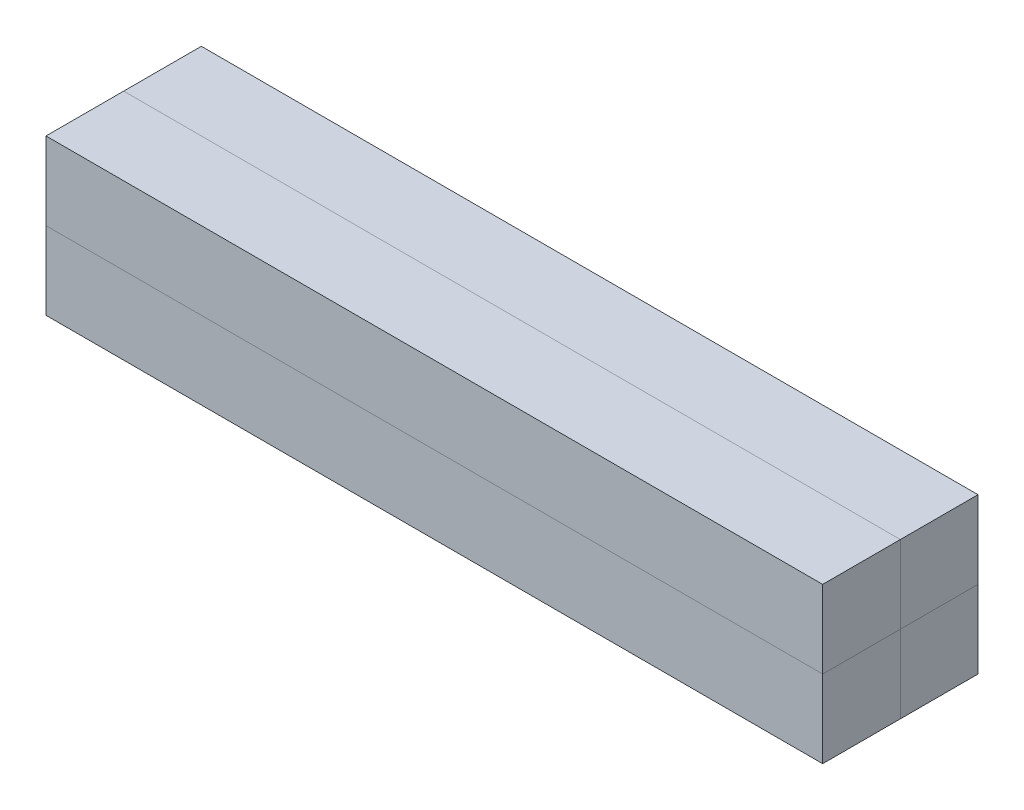
ISO-10303-21;
HEADER;
FILE_DESCRIPTION(('STEP AP214'),'2;1');
FILE_NAME('part.step','',(''),(''),'','','');
FILE_SCHEMA(('AUTOMOTIVE_DESIGN { 1 0 10303 214 1 1 1 1 }'));
ENDSEC;
DATA;
#1=APPLICATION_CONTEXT('core data for automotive mechanical design processes');
#2=APPLICATION_PROTOCOL_DEFINITION('international standard','automotive_design',2000,#1);
#3=PRODUCT_CONTEXT('',#1,'mechanical');
#4=PRODUCT('Part','Part','',(#3));
#5=PRODUCT_RELATED_PRODUCT_CATEGORY('part','',(#4));
#6=PRODUCT_DEFINITION_FORMATION('','',#4);
#7=PRODUCT_DEFINITION_CONTEXT('part definition',#1,'design');
#8=PRODUCT_DEFINITION('design','',#6,#7);
#9=PRODUCT_DEFINITION_SHAPE('','',#8);
#10=(LENGTH_UNIT() NAMED_UNIT(*) SI_UNIT(.MILLI.,.METRE.));
#11=(NAMED_UNIT(*) PLANE_ANGLE_UNIT() SI_UNIT($,.RADIAN.));
#12=(NAMED_UNIT(*) SI_UNIT($,.STERADIAN.) SOLID_ANGLE_UNIT());
#13=UNCERTAINTY_MEASURE_WITH_UNIT(LENGTH_MEASURE(1.E-05),#10,'distance_accuracy_value','');
#14=(GEOMETRIC_REPRESENTATION_CONTEXT(3) GLOBAL_UNCERTAINTY_ASSIGNED_CONTEXT((#13)) GLOBAL_UNIT_ASSIGNED_CONTEXT((#10,
#11,#12)) REPRESENTATION_CONTEXT('',''));
#15=CARTESIAN_POINT('',(0.,0.,0.));
#16=DIRECTION('',(0.,0.,1.));
#17=DIRECTION('',(1.,0.,0.));
#18=AXIS2_PLACEMENT_3D('',#15,#16,#17);
#19=CARTESIAN_POINT('',(0.,0.,0.));
#20=DIRECTION('',(0.,0.,1.));
#21=DIRECTION('',(1.,0.,0.));
#22=AXIS2_PLACEMENT_3D('',#19,#20,#21);
#23=PLANE('',#22);
#24=DIRECTION('',(0.,-1.,0.));
#25=VECTOR('',#24,1.);
#26=CARTESIAN_POINT('',(50.,0.,0.));
#27=LINE('',#26,#25);
#28=CARTESIAN_POINT('',(50.,0.,0.));
#29=VERTEX_POINT('',#28);
#30=CARTESIAN_POINT('',(50.,-5.,0.));
#31=VERTEX_POINT('',#30);
#32=EDGE_CURVE('E122',#29,#31,#27,.T.);
#33=ORIENTED_EDGE('',*,*,#32,.F.);
#34=DIRECTION('',(-1.,0.,0.));
#35=VECTOR('',#34,1.);
#36=CARTESIAN_POINT('',(0.,0.,0.));
#37=LINE('',#36,#35);
#38=CARTESIAN_POINT('',(0.,0.,0.));
#39=VERTEX_POINT('',#38);
#40=EDGE_CURVE('E59',#29,#39,#37,.T.);
#41=ORIENTED_EDGE('',*,*,#40,.T.);
#42=DIRECTION('',(0.,-1.,0.));
#43=VECTOR('',#42,1.);
#44=CARTESIAN_POINT('',(0.,0.,0.));
#45=LINE('',#44,#43);
#46=CARTESIAN_POINT('',(0.,-5.,0.));
#47=VERTEX_POINT('',#46);
#48=EDGE_CURVE('E112',#39,#47,#45,.T.);
#49=ORIENTED_EDGE('',*,*,#48,.T.);
#50=DIRECTION('',(1.,0.,0.));
#51=VECTOR('',#50,1.);
#52=CARTESIAN_POINT('',(50.,-5.,0.));
#53=LINE('',#52,#51);
#54=EDGE_CURVE('E109',#47,#31,#53,.T.);
#55=ORIENTED_EDGE('',*,*,#54,.T.);
#56=EDGE_LOOP('',(#33,#41,#49,#55));
#57=FACE_BOUND('',#56,.T.);
#58=ADVANCED_FACE('F55',(#57),#23,.T.);
#59=CARTESIAN_POINT('',(0.,0.,0.));
#60=DIRECTION('',(0.,1.,0.));
#61=DIRECTION('',(0.,0.,1.));
#62=AXIS2_PLACEMENT_3D('',#59,#60,#61);
#63=PLANE('',#62);
#64=DIRECTION('',(0.,0.,1.));
#65=VECTOR('',#64,1.);
#66=CARTESIAN_POINT('',(50.,0.,0.));
#67=LINE('',#66,#65);
#68=CARTESIAN_POINT('',(50.,0.,-5.));
#69=VERTEX_POINT('',#68);
#70=EDGE_CURVE('E108',#69,#29,#67,.T.);
#71=ORIENTED_EDGE('',*,*,#70,.F.);
#72=DIRECTION('',(-1.,0.,0.));
#73=VECTOR('',#72,1.);
#74=CARTESIAN_POINT('',(50.,0.,-5.));
#75=LINE('',#74,#73);
#76=CARTESIAN_POINT('',(0.,0.,-5.));
#77=VERTEX_POINT('',#76);
#78=EDGE_CURVE('E96',#69,#77,#75,.T.);
#79=ORIENTED_EDGE('',*,*,#78,.T.);
#80=DIRECTION('',(0.,0.,1.));
#81=VECTOR('',#80,1.);
#82=CARTESIAN_POINT('',(0.,0.,0.));
#83=LINE('',#82,#81);
#84=EDGE_CURVE('E106',#77,#39,#83,.T.);
#85=ORIENTED_EDGE('',*,*,#84,.T.);
#86=ORIENTED_EDGE('',*,*,#40,.F.);
#87=EDGE_LOOP('',(#71,#79,#85,#86));
#88=FACE_BOUND('',#87,.T.);
#89=ADVANCED_FACE('F104',(#88),#63,.T.);
#90=CARTESIAN_POINT('',(50.,-5.,-5.));
#91=DIRECTION('',(0.,1.,0.));
#92=DIRECTION('',(0.,0.,1.));
#93=AXIS2_PLACEMENT_3D('',#90,#91,#92);
#94=PLANE('',#93);
#95=ORIENTED_EDGE('',*,*,#54,.F.);
#96=DIRECTION('',(0.,0.,-1.));
#97=VECTOR('',#96,1.);
#98=CARTESIAN_POINT('',(0.,-5.,-5.));
#99=LINE('',#98,#97);
#100=CARTESIAN_POINT('',(0.,-5.,-5.));
#101=VERTEX_POINT('',#100);
#102=EDGE_CURVE('E12',#47,#101,#99,.T.);
#103=ORIENTED_EDGE('',*,*,#102,.T.);
#104=DIRECTION('',(-1.,0.,0.));
#105=VECTOR('',#104,1.);
#106=CARTESIAN_POINT('',(50.,-5.,-5.));
#107=LINE('',#106,#105);
#108=CARTESIAN_POINT('',(50.,-5.,-5.));
#109=VERTEX_POINT('',#108);
#110=EDGE_CURVE('E98',#109,#101,#107,.T.);
#111=ORIENTED_EDGE('',*,*,#110,.F.);
#112=DIRECTION('',(0.,0.,-1.));
#113=VECTOR('',#112,1.);
#114=CARTESIAN_POINT('',(50.,-5.,-5.));
#115=LINE('',#114,#113);
#116=EDGE_CURVE('E101',#31,#109,#115,.T.);
#117=ORIENTED_EDGE('',*,*,#116,.F.);
#118=EDGE_LOOP('',(#95,#103,#111,#117));
#119=FACE_BOUND('',#118,.T.);
#120=ADVANCED_FACE('F129',(#119),#94,.F.);
#121=CARTESIAN_POINT('',(50.,-5.,-5.));
#122=DIRECTION('',(0.,0.,1.));
#123=DIRECTION('',(1.,0.,0.));
#124=AXIS2_PLACEMENT_3D('',#121,#122,#123);
#125=PLANE('',#124);
#126=ORIENTED_EDGE('',*,*,#78,.F.);
#127=DIRECTION('',(0.,1.,0.));
#128=VECTOR('',#127,1.);
#129=CARTESIAN_POINT('',(50.,-5.,-5.));
#130=LINE('',#129,#128);
#131=EDGE_CURVE('E118',#109,#69,#130,.T.);
#132=ORIENTED_EDGE('',*,*,#131,.F.);
#133=ORIENTED_EDGE('',*,*,#110,.T.);
#134=DIRECTION('',(0.,1.,0.));
#135=VECTOR('',#134,1.);
#136=CARTESIAN_POINT('',(0.,-5.,-5.));
#137=LINE('',#136,#135);
#138=EDGE_CURVE('E65',#101,#77,#137,.T.);
#139=ORIENTED_EDGE('',*,*,#138,.T.);
#140=EDGE_LOOP('',(#126,#132,#133,#139));
#141=FACE_BOUND('',#140,.T.);
#142=ADVANCED_FACE('F94',(#141),#125,.F.);
#143=CARTESIAN_POINT('',(0.,0.,0.));
#144=DIRECTION('',(1.,0.,0.));
#145=DIRECTION('',(0.,0.,-1.));
#146=AXIS2_PLACEMENT_3D('',#143,#144,#145);
#147=PLANE('',#146);
#148=ORIENTED_EDGE('',*,*,#84,.F.);
#149=ORIENTED_EDGE('',*,*,#138,.F.);
#150=ORIENTED_EDGE('',*,*,#102,.F.);
#151=ORIENTED_EDGE('',*,*,#48,.F.);
#152=EDGE_LOOP('',(#148,#149,#150,#151));
#153=FACE_BOUND('',#152,.T.);
#154=ADVANCED_FACE('F57',(#153),#147,.F.);
#155=CARTESIAN_POINT('',(50.,0.,0.));
#156=DIRECTION('',(1.,0.,0.));
#157=DIRECTION('',(0.,0.,-1.));
#158=AXIS2_PLACEMENT_3D('',#155,#156,#157);
#159=PLANE('',#158);
#160=ORIENTED_EDGE('',*,*,#131,.T.);
#161=ORIENTED_EDGE('',*,*,#70,.T.);
#162=ORIENTED_EDGE('',*,*,#32,.T.);
#163=ORIENTED_EDGE('',*,*,#116,.T.);
#164=EDGE_LOOP('',(#160,#161,#162,#163));
#165=FACE_BOUND('',#164,.T.);
#166=ADVANCED_FACE('F126',(#165),#159,.T.);
#167=CLOSED_SHELL('',(#58,#89,#120,#142,#154,#166));
#168=MANIFOLD_SOLID_BREP('B2',#167);
#169=CARTESIAN_POINT('',(0.,0.,0.));
#170=DIRECTION('',(0.,0.,1.));
#171=DIRECTION('',(1.,0.,0.));
#172=AXIS2_PLACEMENT_3D('',#169,#170,#171);
#173=PLANE('',#172);
#174=DIRECTION('',(0.,-1.,0.));
#175=VECTOR('',#174,1.);
#176=CARTESIAN_POINT('',(50.,0.,0.));
#177=LINE('',#176,#175);
#178=CARTESIAN_POINT('',(50.,5.,0.));
#179=VERTEX_POINT('',#178);
#180=CARTESIAN_POINT('',(50.,0.,0.));
#181=VERTEX_POINT('',#180);
#182=EDGE_CURVE('E254',#179,#181,#177,.T.);
#183=ORIENTED_EDGE('',*,*,#182,.T.);
#184=DIRECTION('',(-1.,0.,0.));
#185=VECTOR('',#184,1.);
#186=CARTESIAN_POINT('',(0.,0.,0.));
#187=LINE('',#186,#185);
#188=CARTESIAN_POINT('',(0.,0.,0.));
#189=VERTEX_POINT('',#188);
#190=EDGE_CURVE('E250',#181,#189,#187,.T.);
#191=ORIENTED_EDGE('',*,*,#190,.T.);
#192=DIRECTION('',(0.,-1.,0.));
#193=VECTOR('',#192,1.);
#194=CARTESIAN_POINT('',(0.,0.,0.));
#195=LINE('',#194,#193);
#196=CARTESIAN_POINT('',(0.,5.,0.));
#197=VERTEX_POINT('',#196);
#198=EDGE_CURVE('E272',#197,#189,#195,.T.);
#199=ORIENTED_EDGE('',*,*,#198,.F.);
#200=DIRECTION('',(-1.,0.,0.));
#201=VECTOR('',#200,1.);
#202=CARTESIAN_POINT('',(50.,5.,0.));
#203=LINE('',#202,#201);
#204=EDGE_CURVE('E244',#179,#197,#203,.T.);
#205=ORIENTED_EDGE('',*,*,#204,.F.);
#206=EDGE_LOOP('',(#183,#191,#199,#205));
#207=FACE_BOUND('',#206,.T.);
#208=ADVANCED_FACE('F195',(#207),#173,.F.);
#209=CARTESIAN_POINT('',(0.,0.,0.));
#210=DIRECTION('',(0.,1.,0.));
#211=DIRECTION('',(0.,0.,1.));
#212=AXIS2_PLACEMENT_3D('',#209,#210,#211);
#213=PLANE('',#212);
#214=DIRECTION('',(0.,0.,1.));
#215=VECTOR('',#214,1.);
#216=CARTESIAN_POINT('',(50.,0.,0.));
#217=LINE('',#216,#215);
#218=CARTESIAN_POINT('',(50.,0.,5.));
#219=VERTEX_POINT('',#218);
#220=EDGE_CURVE('E245',#181,#219,#217,.T.);
#221=ORIENTED_EDGE('',*,*,#220,.T.);
#222=DIRECTION('',(1.,0.,0.));
#223=VECTOR('',#222,1.);
#224=CARTESIAN_POINT('',(50.,0.,5.));
#225=LINE('',#224,#223);
#226=CARTESIAN_POINT('',(0.,0.,5.));
#227=VERTEX_POINT('',#226);
#228=EDGE_CURVE('E235',#227,#219,#225,.T.);
#229=ORIENTED_EDGE('',*,*,#228,.F.);
#230=DIRECTION('',(0.,0.,1.));
#231=VECTOR('',#230,1.);
#232=CARTESIAN_POINT('',(0.,0.,0.));
#233=LINE('',#232,#231);
#234=EDGE_CURVE('E199',#189,#227,#233,.T.);
#235=ORIENTED_EDGE('',*,*,#234,.F.);
#236=ORIENTED_EDGE('',*,*,#190,.F.);
#237=EDGE_LOOP('',(#221,#229,#235,#236));
#238=FACE_BOUND('',#237,.T.);
#239=ADVANCED_FACE('F248',(#238),#213,.F.);
#240=CARTESIAN_POINT('',(50.,-5.,5.));
#241=DIRECTION('',(0.,0.,-1.));
#242=DIRECTION('',(-1.,0.,0.));
#243=AXIS2_PLACEMENT_3D('',#240,#241,#242);
#244=PLANE('',#243);
#245=DIRECTION('',(0.,-1.,0.));
#246=VECTOR('',#245,1.);
#247=CARTESIAN_POINT('',(0.,-5.,5.));
#248=LINE('',#247,#246);
#249=CARTESIAN_POINT('',(0.,5.,5.));
#250=VERTEX_POINT('',#249);
#251=EDGE_CURVE('E53',#250,#227,#248,.T.);
#252=ORIENTED_EDGE('',*,*,#251,.T.);
#253=ORIENTED_EDGE('',*,*,#228,.T.);
#254=DIRECTION('',(0.,-1.,0.));
#255=VECTOR('',#254,1.);
#256=CARTESIAN_POINT('',(50.,-5.,5.));
#257=LINE('',#256,#255);
#258=CARTESIAN_POINT('',(50.,5.,5.));
#259=VERTEX_POINT('',#258);
#260=EDGE_CURVE('E239',#259,#219,#257,.T.);
#261=ORIENTED_EDGE('',*,*,#260,.F.);
#262=DIRECTION('',(-1.,0.,0.));
#263=VECTOR('',#262,1.);
#264=CARTESIAN_POINT('',(50.,5.,5.));
#265=LINE('',#264,#263);
#266=EDGE_CURVE('E263',#259,#250,#265,.T.);
#267=ORIENTED_EDGE('',*,*,#266,.T.);
#268=EDGE_LOOP('',(#252,#253,#261,#267));
#269=FACE_BOUND('',#268,.T.);
#270=ADVANCED_FACE('F237',(#269),#244,.F.);
#271=CARTESIAN_POINT('',(50.,5.,-5.));
#272=DIRECTION('',(0.,-1.,0.));
#273=DIRECTION('',(0.,0.,-1.));
#274=AXIS2_PLACEMENT_3D('',#271,#272,#273);
#275=PLANE('',#274);
#276=DIRECTION('',(0.,0.,1.));
#277=VECTOR('',#276,1.);
#278=CARTESIAN_POINT('',(50.,5.,-5.));
#279=LINE('',#278,#277);
#280=EDGE_CURVE('E257',#179,#259,#279,.T.);
#281=ORIENTED_EDGE('',*,*,#280,.F.);
#282=ORIENTED_EDGE('',*,*,#204,.T.);
#283=DIRECTION('',(0.,0.,1.));
#284=VECTOR('',#283,1.);
#285=CARTESIAN_POINT('',(0.,5.,-5.));
#286=LINE('',#285,#284);
#287=EDGE_CURVE('E206',#197,#250,#286,.T.);
#288=ORIENTED_EDGE('',*,*,#287,.T.);
#289=ORIENTED_EDGE('',*,*,#266,.F.);
#290=EDGE_LOOP('',(#281,#282,#288,#289));
#291=FACE_BOUND('',#290,.T.);
#292=ADVANCED_FACE('F281',(#291),#275,.F.);
#293=CARTESIAN_POINT('',(50.,0.,0.));
#294=DIRECTION('',(1.,0.,0.));
#295=DIRECTION('',(0.,0.,-1.));
#296=AXIS2_PLACEMENT_3D('',#293,#294,#295);
#297=PLANE('',#296);
#298=ORIENTED_EDGE('',*,*,#220,.F.);
#299=ORIENTED_EDGE('',*,*,#182,.F.);
#300=ORIENTED_EDGE('',*,*,#280,.T.);
#301=ORIENTED_EDGE('',*,*,#260,.T.);
#302=EDGE_LOOP('',(#298,#299,#300,#301));
#303=FACE_BOUND('',#302,.T.);
#304=ADVANCED_FACE('F197',(#303),#297,.T.);
#305=CARTESIAN_POINT('',(0.,0.,0.));
#306=DIRECTION('',(1.,0.,0.));
#307=DIRECTION('',(0.,0.,-1.));
#308=AXIS2_PLACEMENT_3D('',#305,#306,#307);
#309=PLANE('',#308);
#310=ORIENTED_EDGE('',*,*,#198,.T.);
#311=ORIENTED_EDGE('',*,*,#234,.T.);
#312=ORIENTED_EDGE('',*,*,#251,.F.);
#313=ORIENTED_EDGE('',*,*,#287,.F.);
#314=EDGE_LOOP('',(#310,#311,#312,#313));
#315=FACE_BOUND('',#314,.T.);
#316=ADVANCED_FACE('F277',(#315),#309,.F.);
#317=CLOSED_SHELL('',(#208,#239,#270,#292,#304,#316));
#318=MANIFOLD_SOLID_BREP('B6',#317);
#319=CARTESIAN_POINT('',(0.,0.,0.));
#320=DIRECTION('',(0.,0.,1.));
#321=DIRECTION('',(1.,0.,0.));
#322=AXIS2_PLACEMENT_3D('',#319,#320,#321);
#323=PLANE('',#322);
#324=DIRECTION('',(0.,-1.,0.));
#325=VECTOR('',#324,1.);
#326=CARTESIAN_POINT('',(50.,0.,0.));
#327=LINE('',#326,#325);
#328=CARTESIAN_POINT('',(50.,0.,0.));
#329=VERTEX_POINT('',#328);
#330=CARTESIAN_POINT('',(50.,-5.,0.));
#331=VERTEX_POINT('',#330);
#332=EDGE_CURVE('E397',#329,#331,#327,.T.);
#333=ORIENTED_EDGE('',*,*,#332,.T.);
#334=DIRECTION('',(1.,0.,0.));
#335=VECTOR('',#334,1.);
#336=CARTESIAN_POINT('',(50.,-5.,0.));
#337=LINE('',#336,#335);
#338=CARTESIAN_POINT('',(0.,-5.,0.));
#339=VERTEX_POINT('',#338);
#340=EDGE_CURVE('E396',#339,#331,#337,.T.);
#341=ORIENTED_EDGE('',*,*,#340,.F.);
#342=DIRECTION('',(0.,-1.,0.));
#343=VECTOR('',#342,1.);
#344=CARTESIAN_POINT('',(0.,0.,0.));
#345=LINE('',#344,#343);
#346=CARTESIAN_POINT('',(0.,0.,0.));
#347=VERTEX_POINT('',#346);
#348=EDGE_CURVE('E413',#347,#339,#345,.T.);
#349=ORIENTED_EDGE('',*,*,#348,.F.);
#350=DIRECTION('',(-1.,0.,0.));
#351=VECTOR('',#350,1.);
#352=CARTESIAN_POINT('',(0.,0.,0.));
#353=LINE('',#352,#351);
#354=EDGE_CURVE('E193',#329,#347,#353,.T.);
#355=ORIENTED_EDGE('',*,*,#354,.F.);
#356=EDGE_LOOP('',(#333,#341,#349,#355));
#357=FACE_BOUND('',#356,.T.);
#358=ADVANCED_FACE('F346',(#357),#323,.F.);
#359=CARTESIAN_POINT('',(0.,0.,0.));
#360=DIRECTION('',(0.,1.,0.));
#361=DIRECTION('',(0.,0.,1.));
#362=AXIS2_PLACEMENT_3D('',#359,#360,#361);
#363=PLANE('',#362);
#364=DIRECTION('',(0.,0.,1.));
#365=VECTOR('',#364,1.);
#366=CARTESIAN_POINT('',(50.,0.,0.));
#367=LINE('',#366,#365);
#368=CARTESIAN_POINT('',(50.,0.,5.));
#369=VERTEX_POINT('',#368);
#370=EDGE_CURVE('E415',#329,#369,#367,.T.);
#371=ORIENTED_EDGE('',*,*,#370,.F.);
#372=ORIENTED_EDGE('',*,*,#354,.T.);
#373=DIRECTION('',(0.,0.,1.));
#374=VECTOR('',#373,1.);
#375=CARTESIAN_POINT('',(0.,0.,0.));
#376=LINE('',#375,#374);
#377=CARTESIAN_POINT('',(0.,0.,5.));
#378=VERTEX_POINT('',#377);
#379=EDGE_CURVE('E350',#347,#378,#376,.T.);
#380=ORIENTED_EDGE('',*,*,#379,.T.);
#381=DIRECTION('',(1.,0.,0.));
#382=VECTOR('',#381,1.);
#383=CARTESIAN_POINT('',(50.,0.,5.));
#384=LINE('',#383,#382);
#385=EDGE_CURVE('E391',#378,#369,#384,.T.);
#386=ORIENTED_EDGE('',*,*,#385,.T.);
#387=EDGE_LOOP('',(#371,#372,#380,#386));
#388=FACE_BOUND('',#387,.T.);
#389=ADVANCED_FACE('F399',(#388),#363,.T.);
#390=CARTESIAN_POINT('',(50.,-5.,5.));
#391=DIRECTION('',(0.,0.,-1.));
#392=DIRECTION('',(-1.,0.,0.));
#393=AXIS2_PLACEMENT_3D('',#390,#391,#392);
#394=PLANE('',#393);
#395=ORIENTED_EDGE('',*,*,#385,.F.);
#396=DIRECTION('',(0.,-1.,0.));
#397=VECTOR('',#396,1.);
#398=CARTESIAN_POINT('',(0.,-5.,5.));
#399=LINE('',#398,#397);
#400=CARTESIAN_POINT('',(0.,-5.,5.));
#401=VERTEX_POINT('',#400);
#402=EDGE_CURVE('E356',#378,#401,#399,.T.);
#403=ORIENTED_EDGE('',*,*,#402,.T.);
#404=DIRECTION('',(-1.,0.,0.));
#405=VECTOR('',#404,1.);
#406=CARTESIAN_POINT('',(50.,-5.,5.));
#407=LINE('',#406,#405);
#408=CARTESIAN_POINT('',(50.,-5.,5.));
#409=VERTEX_POINT('',#408);
#410=EDGE_CURVE('E410',#409,#401,#407,.T.);
#411=ORIENTED_EDGE('',*,*,#410,.F.);
#412=DIRECTION('',(0.,-1.,0.));
#413=VECTOR('',#412,1.);
#414=CARTESIAN_POINT('',(50.,-5.,5.));
#415=LINE('',#414,#413);
#416=EDGE_CURVE('E393',#369,#409,#415,.T.);
#417=ORIENTED_EDGE('',*,*,#416,.F.);
#418=EDGE_LOOP('',(#395,#403,#411,#417));
#419=FACE_BOUND('',#418,.T.);
#420=ADVANCED_FACE('F392',(#419),#394,.F.);
#421=CARTESIAN_POINT('',(50.,-5.,-5.));
#422=DIRECTION('',(0.,1.,0.));
#423=DIRECTION('',(0.,0.,1.));
#424=AXIS2_PLACEMENT_3D('',#421,#422,#423);
#425=PLANE('',#424);
#426=DIRECTION('',(0.,0.,-1.));
#427=VECTOR('',#426,1.);
#428=CARTESIAN_POINT('',(0.,-5.,-5.));
#429=LINE('',#428,#427);
#430=EDGE_CURVE('E386',#401,#339,#429,.T.);
#431=ORIENTED_EDGE('',*,*,#430,.T.);
#432=ORIENTED_EDGE('',*,*,#340,.T.);
#433=DIRECTION('',(0.,0.,-1.));
#434=VECTOR('',#433,1.);
#435=CARTESIAN_POINT('',(50.,-5.,-5.));
#436=LINE('',#435,#434);
#437=EDGE_CURVE('E407',#409,#331,#436,.T.);
#438=ORIENTED_EDGE('',*,*,#437,.F.);
#439=ORIENTED_EDGE('',*,*,#410,.T.);
#440=EDGE_LOOP('',(#431,#432,#438,#439));
#441=FACE_BOUND('',#440,.T.);
#442=ADVANCED_FACE('F420',(#441),#425,.F.);
#443=CARTESIAN_POINT('',(0.,0.,0.));
#444=DIRECTION('',(1.,0.,0.));
#445=DIRECTION('',(0.,0.,-1.));
#446=AXIS2_PLACEMENT_3D('',#443,#444,#445);
#447=PLANE('',#446);
#448=ORIENTED_EDGE('',*,*,#379,.F.);
#449=ORIENTED_EDGE('',*,*,#348,.T.);
#450=ORIENTED_EDGE('',*,*,#430,.F.);
#451=ORIENTED_EDGE('',*,*,#402,.F.);
#452=EDGE_LOOP('',(#448,#449,#450,#451));
#453=FACE_BOUND('',#452,.T.);
#454=ADVANCED_FACE('F383',(#453),#447,.F.);
#455=CARTESIAN_POINT('',(50.,0.,0.));
#456=DIRECTION('',(1.,0.,0.));
#457=DIRECTION('',(0.,0.,-1.));
#458=AXIS2_PLACEMENT_3D('',#455,#456,#457);
#459=PLANE('',#458);
#460=ORIENTED_EDGE('',*,*,#332,.F.);
#461=ORIENTED_EDGE('',*,*,#370,.T.);
#462=ORIENTED_EDGE('',*,*,#416,.T.);
#463=ORIENTED_EDGE('',*,*,#437,.T.);
#464=EDGE_LOOP('',(#460,#461,#462,#463));
#465=FACE_BOUND('',#464,.T.);
#466=ADVANCED_FACE('F348',(#465),#459,.T.);
#467=CLOSED_SHELL('',(#358,#389,#420,#442,#454,#466));
#468=MANIFOLD_SOLID_BREP('B47',#467);
#469=CARTESIAN_POINT('',(0.,0.,0.));
#470=DIRECTION('',(0.,1.,0.));
#471=DIRECTION('',(0.,0.,1.));
#472=AXIS2_PLACEMENT_3D('',#469,#470,#471);
#473=PLANE('',#472);
#474=DIRECTION('',(0.,0.,1.));
#475=VECTOR('',#474,1.);
#476=CARTESIAN_POINT('',(50.,0.,0.));
#477=LINE('',#476,#475);
#478=CARTESIAN_POINT('',(50.,0.,-5.));
#479=VERTEX_POINT('',#478);
#480=CARTESIAN_POINT('',(50.,0.,0.));
#481=VERTEX_POINT('',#480);
#482=EDGE_CURVE('E528',#479,#481,#477,.T.);
#483=ORIENTED_EDGE('',*,*,#482,.T.);
#484=DIRECTION('',(-1.,0.,0.));
#485=VECTOR('',#484,1.);
#486=CARTESIAN_POINT('',(0.,0.,0.));
#487=LINE('',#486,#485);
#488=CARTESIAN_POINT('',(0.,0.,0.));
#489=VERTEX_POINT('',#488);
#490=EDGE_CURVE('E344',#481,#489,#487,.T.);
#491=ORIENTED_EDGE('',*,*,#490,.T.);
#492=DIRECTION('',(0.,0.,1.));
#493=VECTOR('',#492,1.);
#494=CARTESIAN_POINT('',(0.,0.,0.));
#495=LINE('',#494,#493);
#496=CARTESIAN_POINT('',(0.,0.,-5.));
#497=VERTEX_POINT('',#496);
#498=EDGE_CURVE('E499',#497,#489,#495,.T.);
#499=ORIENTED_EDGE('',*,*,#498,.F.);
#500=DIRECTION('',(-1.,0.,0.));
#501=VECTOR('',#500,1.);
#502=CARTESIAN_POINT('',(50.,0.,-5.));
#503=LINE('',#502,#501);
#504=EDGE_CURVE('E544',#479,#497,#503,.T.);
#505=ORIENTED_EDGE('',*,*,#504,.F.);
#506=EDGE_LOOP('',(#483,#491,#499,#505));
#507=FACE_BOUND('',#506,.T.);
#508=ADVANCED_FACE('F475',(#507),#473,.F.);
#509=CARTESIAN_POINT('',(0.,0.,0.));
#510=DIRECTION('',(0.,0.,1.));
#511=DIRECTION('',(1.,0.,0.));
#512=AXIS2_PLACEMENT_3D('',#509,#510,#511);
#513=PLANE('',#512);
#514=DIRECTION('',(0.,-1.,0.));
#515=VECTOR('',#514,1.);
#516=CARTESIAN_POINT('',(50.,0.,0.));
#517=LINE('',#516,#515);
#518=CARTESIAN_POINT('',(50.,5.,0.));
#519=VERTEX_POINT('',#518);
#520=EDGE_CURVE('E478',#519,#481,#517,.T.);
#521=ORIENTED_EDGE('',*,*,#520,.F.);
#522=DIRECTION('',(-1.,0.,0.));
#523=VECTOR('',#522,1.);
#524=CARTESIAN_POINT('',(50.,5.,0.));
#525=LINE('',#524,#523);
#526=CARTESIAN_POINT('',(0.,5.,0.));
#527=VERTEX_POINT('',#526);
#528=EDGE_CURVE('E536',#519,#527,#525,.T.);
#529=ORIENTED_EDGE('',*,*,#528,.T.);
#530=DIRECTION('',(0.,-1.,0.));
#531=VECTOR('',#530,1.);
#532=CARTESIAN_POINT('',(0.,0.,0.));
#533=LINE('',#532,#531);
#534=EDGE_CURVE('E483',#527,#489,#533,.T.);
#535=ORIENTED_EDGE('',*,*,#534,.T.);
#536=ORIENTED_EDGE('',*,*,#490,.F.);
#537=EDGE_LOOP('',(#521,#529,#535,#536));
#538=FACE_BOUND('',#537,.T.);
#539=ADVANCED_FACE('F547',(#538),#513,.T.);
#540=CARTESIAN_POINT('',(50.,-5.,-5.));
#541=DIRECTION('',(0.,0.,1.));
#542=DIRECTION('',(1.,0.,0.));
#543=AXIS2_PLACEMENT_3D('',#540,#541,#542);
#544=PLANE('',#543);
#545=DIRECTION('',(0.,1.,0.));
#546=VECTOR('',#545,1.);
#547=CARTESIAN_POINT('',(50.,-5.,-5.));
#548=LINE('',#547,#546);
#549=CARTESIAN_POINT('',(50.,5.,-5.));
#550=VERTEX_POINT('',#549);
#551=EDGE_CURVE('E521',#479,#550,#548,.T.);
#552=ORIENTED_EDGE('',*,*,#551,.F.);
#553=ORIENTED_EDGE('',*,*,#504,.T.);
#554=DIRECTION('',(0.,1.,0.));
#555=VECTOR('',#554,1.);
#556=CARTESIAN_POINT('',(0.,-5.,-5.));
#557=LINE('',#556,#555);
#558=CARTESIAN_POINT('',(0.,5.,-5.));
#559=VERTEX_POINT('',#558);
#560=EDGE_CURVE('E533',#497,#559,#557,.T.);
#561=ORIENTED_EDGE('',*,*,#560,.T.);
#562=DIRECTION('',(-1.,0.,0.));
#563=VECTOR('',#562,1.);
#564=CARTESIAN_POINT('',(50.,5.,-5.));
#565=LINE('',#564,#563);
#566=EDGE_CURVE('E531',#550,#559,#565,.T.);
#567=ORIENTED_EDGE('',*,*,#566,.F.);
#568=EDGE_LOOP('',(#552,#553,#561,#567));
#569=FACE_BOUND('',#568,.T.);
#570=ADVANCED_FACE('F532',(#569),#544,.F.);
#571=CARTESIAN_POINT('',(50.,5.,-5.));
#572=DIRECTION('',(0.,-1.,0.));
#573=DIRECTION('',(0.,0.,-1.));
#574=AXIS2_PLACEMENT_3D('',#571,#572,#573);
#575=PLANE('',#574);
#576=ORIENTED_EDGE('',*,*,#528,.F.);
#577=DIRECTION('',(0.,0.,1.));
#578=VECTOR('',#577,1.);
#579=CARTESIAN_POINT('',(50.,5.,-5.));
#580=LINE('',#579,#578);
#581=EDGE_CURVE('E526',#550,#519,#580,.T.);
#582=ORIENTED_EDGE('',*,*,#581,.F.);
#583=ORIENTED_EDGE('',*,*,#566,.T.);
#584=DIRECTION('',(0.,0.,1.));
#585=VECTOR('',#584,1.);
#586=CARTESIAN_POINT('',(0.,5.,-5.));
#587=LINE('',#586,#585);
#588=EDGE_CURVE('E491',#559,#527,#587,.T.);
#589=ORIENTED_EDGE('',*,*,#588,.T.);
#590=EDGE_LOOP('',(#576,#582,#583,#589));
#591=FACE_BOUND('',#590,.T.);
#592=ADVANCED_FACE('F535',(#591),#575,.F.);
#593=CARTESIAN_POINT('',(0.,0.,0.));
#594=DIRECTION('',(1.,0.,0.));
#595=DIRECTION('',(0.,0.,-1.));
#596=AXIS2_PLACEMENT_3D('',#593,#594,#595);
#597=PLANE('',#596);
#598=ORIENTED_EDGE('',*,*,#534,.F.);
#599=ORIENTED_EDGE('',*,*,#588,.F.);
#600=ORIENTED_EDGE('',*,*,#560,.F.);
#601=ORIENTED_EDGE('',*,*,#498,.T.);
#602=EDGE_LOOP('',(#598,#599,#600,#601));
#603=FACE_BOUND('',#602,.T.);
#604=ADVANCED_FACE('F548',(#603),#597,.F.);
#605=CARTESIAN_POINT('',(50.,0.,0.));
#606=DIRECTION('',(1.,0.,0.));
#607=DIRECTION('',(0.,0.,-1.));
#608=AXIS2_PLACEMENT_3D('',#605,#606,#607);
#609=PLANE('',#608);
#610=ORIENTED_EDGE('',*,*,#581,.T.);
#611=ORIENTED_EDGE('',*,*,#520,.T.);
#612=ORIENTED_EDGE('',*,*,#482,.F.);
#613=ORIENTED_EDGE('',*,*,#551,.T.);
#614=EDGE_LOOP('',(#610,#611,#612,#613));
#615=FACE_BOUND('',#614,.T.);
#616=ADVANCED_FACE('F523',(#615),#609,.T.);
#617=CLOSED_SHELL('',(#508,#539,#570,#592,#604,#616));
#618=MANIFOLD_SOLID_BREP('B187',#617);
#619=ADVANCED_BREP_SHAPE_REPRESENTATION('',(#18,#168,#318,#468,#618),#14);
#620=SHAPE_DEFINITION_REPRESENTATION(#9,#619);
ENDSEC;
END-ISO-10303-21;
